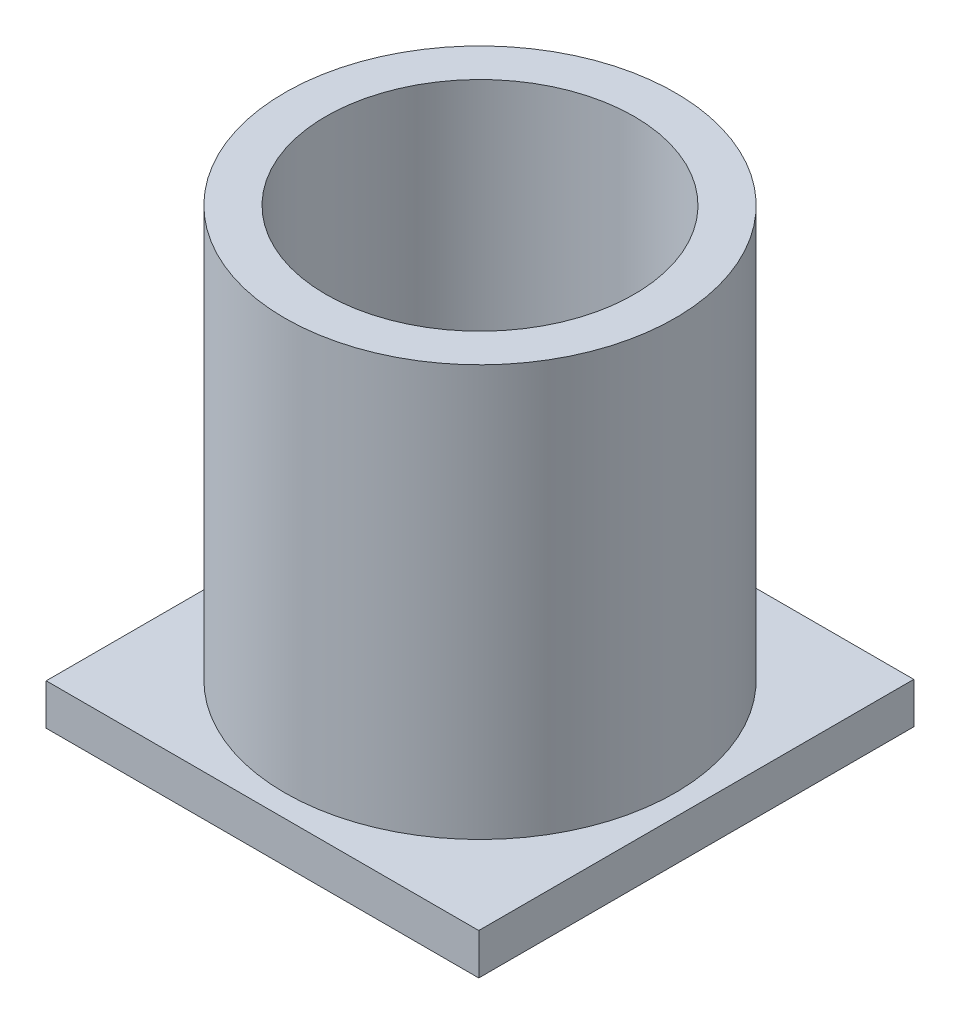
ISO-10303-21;
HEADER;
FILE_DESCRIPTION(('STEP AP214'),'2;1');
FILE_NAME('part.step','',(''),(''),'','','');
FILE_SCHEMA(('AUTOMOTIVE_DESIGN { 1 0 10303 214 1 1 1 1 }'));
ENDSEC;
DATA;
#1=APPLICATION_CONTEXT('core data for automotive mechanical design processes');
#2=APPLICATION_PROTOCOL_DEFINITION('international standard','automotive_design',2000,#1);
#3=PRODUCT_CONTEXT('',#1,'mechanical');
#4=PRODUCT('Part','Part','',(#3));
#5=PRODUCT_RELATED_PRODUCT_CATEGORY('part','',(#4));
#6=PRODUCT_DEFINITION_FORMATION('','',#4);
#7=PRODUCT_DEFINITION_CONTEXT('part definition',#1,'design');
#8=PRODUCT_DEFINITION('design','',#6,#7);
#9=PRODUCT_DEFINITION_SHAPE('','',#8);
#10=(LENGTH_UNIT() NAMED_UNIT(*) SI_UNIT(.MILLI.,.METRE.));
#11=(NAMED_UNIT(*) PLANE_ANGLE_UNIT() SI_UNIT($,.RADIAN.));
#12=(NAMED_UNIT(*) SI_UNIT($,.STERADIAN.) SOLID_ANGLE_UNIT());
#13=UNCERTAINTY_MEASURE_WITH_UNIT(LENGTH_MEASURE(1.E-05),#10,'distance_accuracy_value','');
#14=(GEOMETRIC_REPRESENTATION_CONTEXT(3) GLOBAL_UNCERTAINTY_ASSIGNED_CONTEXT((#13)) GLOBAL_UNIT_ASSIGNED_CONTEXT((#10,
#11,#12)) REPRESENTATION_CONTEXT('',''));
#15=CARTESIAN_POINT('',(0.,0.,0.));
#16=DIRECTION('',(0.,0.,1.));
#17=DIRECTION('',(1.,0.,0.));
#18=AXIS2_PLACEMENT_3D('',#15,#16,#17);
#19=CARTESIAN_POINT('',(0.000317301244510298,2318.51783606415,0.666304939163612));
#20=DIRECTION('',(0.,1.,0.));
#21=DIRECTION('',(0.,0.,1.));
#22=AXIS2_PLACEMENT_3D('',#19,#20,#21);
#23=PLANE('',#22);
#24=CARTESIAN_POINT('',(0.000317301244510298,2318.51783606415,0.666304939163612));
#25=DIRECTION('',(0.,1.,0.));
#26=DIRECTION('',(0.,0.,1.));
#27=AXIS2_PLACEMENT_3D('',#24,#25,#26);
#28=CIRCLE('',#27,1425.);
#29=CARTESIAN_POINT('',(0.000317301244510298,2318.51783606415,1425.66630493916));
#30=VERTEX_POINT('',#29);
#31=EDGE_CURVE('E11',#30,#30,#28,.T.);
#32=ORIENTED_EDGE('',*,*,#31,.T.);
#33=EDGE_LOOP('',(#32));
#34=FACE_BOUND('',#33,.T.);
#35=CARTESIAN_POINT('',(0.000317301244510298,2318.51783606415,0.666304939163612));
#36=DIRECTION('',(0.,1.,0.));
#37=DIRECTION('',(0.,0.,1.));
#38=AXIS2_PLACEMENT_3D('',#35,#36,#37);
#39=CIRCLE('',#38,1125.);
#40=CARTESIAN_POINT('',(0.000317301244510298,2318.51783606415,1125.66630493916));
#41=VERTEX_POINT('',#40);
#42=EDGE_CURVE('E45',#41,#41,#39,.T.);
#43=ORIENTED_EDGE('',*,*,#42,.F.);
#44=EDGE_LOOP('',(#43));
#45=FACE_BOUND('',#44,.T.);
#46=ADVANCED_FACE('F35',(#34,#45),#23,.T.);
#47=CARTESIAN_POINT('',(0.000317301244510298,2318.51783606415,0.666304939163612));
#48=DIRECTION('',(0.,-1.,0.));
#49=DIRECTION('',(0.,0.,-1.));
#50=AXIS2_PLACEMENT_3D('',#47,#48,#49);
#51=CYLINDRICAL_SURFACE('',#50,1425.);
#52=ORIENTED_EDGE('',*,*,#31,.F.);
#53=EDGE_LOOP('',(#52));
#54=FACE_BOUND('',#53,.T.);
#55=CARTESIAN_POINT('',(0.000317301244510298,-681.482163935852,0.666304939163612));
#56=DIRECTION('',(0.,1.,0.));
#57=DIRECTION('',(0.,0.,1.));
#58=AXIS2_PLACEMENT_3D('',#55,#56,#57);
#59=CIRCLE('',#58,1425.);
#60=CARTESIAN_POINT('',(0.000317301244510298,-681.482163935852,1425.66630493916));
#61=VERTEX_POINT('',#60);
#62=EDGE_CURVE('E115',#61,#61,#59,.T.);
#63=ORIENTED_EDGE('',*,*,#62,.T.);
#64=EDGE_LOOP('',(#63));
#65=FACE_BOUND('',#64,.T.);
#66=ADVANCED_FACE('F37',(#54,#65),#51,.T.);
#67=CARTESIAN_POINT('',(0.000317301244510298,2318.51783606415,0.666304939163612));
#68=DIRECTION('',(0.,-1.,0.));
#69=DIRECTION('',(0.,0.,-1.));
#70=AXIS2_PLACEMENT_3D('',#67,#68,#69);
#71=CYLINDRICAL_SURFACE('',#70,1125.);
#72=ORIENTED_EDGE('',*,*,#42,.T.);
#73=EDGE_LOOP('',(#72));
#74=FACE_BOUND('',#73,.T.);
#75=CARTESIAN_POINT('',(0.000317301244510298,-681.482163935852,0.666304939163612));
#76=DIRECTION('',(0.,1.,0.));
#77=DIRECTION('',(0.,0.,1.));
#78=AXIS2_PLACEMENT_3D('',#75,#76,#77);
#79=CIRCLE('',#78,1125.);
#80=CARTESIAN_POINT('',(0.000317301244510298,-681.482163935852,1125.66630493916));
#81=VERTEX_POINT('',#80);
#82=EDGE_CURVE('E118',#81,#81,#79,.T.);
#83=ORIENTED_EDGE('',*,*,#82,.F.);
#84=EDGE_LOOP('',(#83));
#85=FACE_BOUND('',#84,.T.);
#86=ADVANCED_FACE('F148',(#74,#85),#71,.F.);
#87=CARTESIAN_POINT('',(0.000317301244510298,-681.482163935852,0.666304939163612));
#88=DIRECTION('',(0.,-1.,0.));
#89=DIRECTION('',(0.,0.,-1.));
#90=AXIS2_PLACEMENT_3D('',#87,#88,#89);
#91=PLANE('',#90);
#92=CARTESIAN_POINT('',(0.000317301244510298,-681.482163935852,0.666304939163612));
#93=DIRECTION('',(0.,-1.,0.));
#94=DIRECTION('',(0.,0.,1.));
#95=AXIS2_PLACEMENT_3D('',#92,#93,#94);
#96=ELLIPSE('',#95,318.198051533946,225.);
#97=CARTESIAN_POINT('',(0.000317301244510298,-681.482163935852,318.86435647311));
#98=VERTEX_POINT('',#97);
#99=EDGE_CURVE('E108',#98,#98,#96,.T.);
#100=ORIENTED_EDGE('',*,*,#99,.T.);
#101=EDGE_LOOP('',(#100));
#102=FACE_BOUND('',#101,.T.);
#103=ORIENTED_EDGE('',*,*,#82,.T.);
#104=EDGE_LOOP('',(#103));
#105=FACE_BOUND('',#104,.T.);
#106=ADVANCED_FACE('F129',(#102,#105),#91,.F.);
#107=CARTESIAN_POINT('',(1578.24370591622,-981.482163935852,1587.95406827398));
#108=DIRECTION('',(-1.,0.,0.));
#109=DIRECTION('',(0.,0.,1.));
#110=AXIS2_PLACEMENT_3D('',#107,#108,#109);
#111=PLANE('',#110);
#112=DIRECTION('',(0.,0.,1.));
#113=VECTOR('',#112,1.);
#114=CARTESIAN_POINT('',(1578.24370591622,-681.482163935852,1587.95406827398));
#115=LINE('',#114,#113);
#116=CARTESIAN_POINT('',(1578.24370591622,-681.482163935852,-1586.62145839565));
#117=VERTEX_POINT('',#116);
#118=CARTESIAN_POINT('',(1578.24370591622,-681.482163935852,1587.95406827398));
#119=VERTEX_POINT('',#118);
#120=EDGE_CURVE('E105',#117,#119,#115,.T.);
#121=ORIENTED_EDGE('',*,*,#120,.T.);
#122=DIRECTION('',(0.,1.,0.));
#123=VECTOR('',#122,1.);
#124=CARTESIAN_POINT('',(1578.24370591622,-981.482163935852,1587.95406827398));
#125=LINE('',#124,#123);
#126=CARTESIAN_POINT('',(1578.24370591622,-981.482163935852,1587.95406827398));
#127=VERTEX_POINT('',#126);
#128=EDGE_CURVE('E96',#127,#119,#125,.T.);
#129=ORIENTED_EDGE('',*,*,#128,.F.);
#130=DIRECTION('',(0.,0.,1.));
#131=VECTOR('',#130,1.);
#132=CARTESIAN_POINT('',(1578.24370591622,-981.482163935852,1587.95406827398));
#133=LINE('',#132,#131);
#134=CARTESIAN_POINT('',(1578.24370591622,-981.482163935852,-1586.62145839565));
#135=VERTEX_POINT('',#134);
#136=EDGE_CURVE('E90',#135,#127,#133,.T.);
#137=ORIENTED_EDGE('',*,*,#136,.F.);
#138=DIRECTION('',(0.,1.,0.));
#139=VECTOR('',#138,1.);
#140=CARTESIAN_POINT('',(1578.24370591622,-981.482163935852,-1586.62145839565));
#141=LINE('',#140,#139);
#142=EDGE_CURVE('E101',#135,#117,#141,.T.);
#143=ORIENTED_EDGE('',*,*,#142,.T.);
#144=EDGE_LOOP('',(#121,#129,#137,#143));
#145=FACE_BOUND('',#144,.T.);
#146=ADVANCED_FACE('F132',(#145),#111,.F.);
#147=CARTESIAN_POINT('',(-1578.24307131373,-981.482163935852,1587.95406827398));
#148=DIRECTION('',(0.,0.,-1.));
#149=DIRECTION('',(-1.,0.,0.));
#150=AXIS2_PLACEMENT_3D('',#147,#148,#149);
#151=PLANE('',#150);
#152=DIRECTION('',(-1.,0.,0.));
#153=VECTOR('',#152,1.);
#154=CARTESIAN_POINT('',(-1578.24307131373,-681.482163935852,1587.95406827398));
#155=LINE('',#154,#153);
#156=CARTESIAN_POINT('',(-1578.24307131373,-681.482163935852,1587.95406827398));
#157=VERTEX_POINT('',#156);
#158=EDGE_CURVE('E95',#119,#157,#155,.T.);
#159=ORIENTED_EDGE('',*,*,#158,.T.);
#160=DIRECTION('',(0.,1.,0.));
#161=VECTOR('',#160,1.);
#162=CARTESIAN_POINT('',(-1578.24307131373,-981.482163935852,1587.95406827398));
#163=LINE('',#162,#161);
#164=CARTESIAN_POINT('',(-1578.24307131373,-981.482163935852,1587.95406827398));
#165=VERTEX_POINT('',#164);
#166=EDGE_CURVE('E93',#165,#157,#163,.T.);
#167=ORIENTED_EDGE('',*,*,#166,.F.);
#168=DIRECTION('',(-1.,0.,0.));
#169=VECTOR('',#168,1.);
#170=CARTESIAN_POINT('',(-1578.24307131373,-981.482163935852,1587.95406827398));
#171=LINE('',#170,#169);
#172=EDGE_CURVE('E85',#127,#165,#171,.T.);
#173=ORIENTED_EDGE('',*,*,#172,.F.);
#174=ORIENTED_EDGE('',*,*,#128,.T.);
#175=EDGE_LOOP('',(#159,#167,#173,#174));
#176=FACE_BOUND('',#175,.T.);
#177=ADVANCED_FACE('F94',(#176),#151,.F.);
#178=CARTESIAN_POINT('',(-1578.24307131373,-981.482163935852,1587.95406827398));
#179=DIRECTION('',(1.,0.,0.));
#180=DIRECTION('',(0.,0.,-1.));
#181=AXIS2_PLACEMENT_3D('',#178,#179,#180);
#182=PLANE('',#181);
#183=DIRECTION('',(0.,0.,-1.));
#184=VECTOR('',#183,1.);
#185=CARTESIAN_POINT('',(-1578.24307131373,-681.482163935852,1587.95406827398));
#186=LINE('',#185,#184);
#187=CARTESIAN_POINT('',(-1578.24307131373,-681.482163935852,-1586.62145839565));
#188=VERTEX_POINT('',#187);
#189=EDGE_CURVE('E71',#157,#188,#186,.T.);
#190=ORIENTED_EDGE('',*,*,#189,.T.);
#191=DIRECTION('',(0.,1.,0.));
#192=VECTOR('',#191,1.);
#193=CARTESIAN_POINT('',(-1578.24307131373,-981.482163935852,-1586.62145839565));
#194=LINE('',#193,#192);
#195=CARTESIAN_POINT('',(-1578.24307131373,-981.482163935852,-1586.62145839565));
#196=VERTEX_POINT('',#195);
#197=EDGE_CURVE('E97',#196,#188,#194,.T.);
#198=ORIENTED_EDGE('',*,*,#197,.F.);
#199=DIRECTION('',(0.,0.,-1.));
#200=VECTOR('',#199,1.);
#201=CARTESIAN_POINT('',(-1578.24307131373,-981.482163935852,1587.95406827398));
#202=LINE('',#201,#200);
#203=EDGE_CURVE('E88',#165,#196,#202,.T.);
#204=ORIENTED_EDGE('',*,*,#203,.F.);
#205=ORIENTED_EDGE('',*,*,#166,.T.);
#206=EDGE_LOOP('',(#190,#198,#204,#205));
#207=FACE_BOUND('',#206,.T.);
#208=ADVANCED_FACE('F99',(#207),#182,.F.);
#209=CARTESIAN_POINT('',(-1578.24307131373,-981.482163935852,-1586.62145839565));
#210=DIRECTION('',(0.,0.,1.));
#211=DIRECTION('',(1.,0.,0.));
#212=AXIS2_PLACEMENT_3D('',#209,#210,#211);
#213=PLANE('',#212);
#214=DIRECTION('',(1.,0.,0.));
#215=VECTOR('',#214,1.);
#216=CARTESIAN_POINT('',(-1578.24307131373,-681.482163935852,-1586.62145839565));
#217=LINE('',#216,#215);
#218=EDGE_CURVE('E77',#188,#117,#217,.T.);
#219=ORIENTED_EDGE('',*,*,#218,.T.);
#220=ORIENTED_EDGE('',*,*,#142,.F.);
#221=DIRECTION('',(1.,0.,0.));
#222=VECTOR('',#221,1.);
#223=CARTESIAN_POINT('',(-1578.24307131373,-981.482163935852,-1586.62145839565));
#224=LINE('',#223,#222);
#225=EDGE_CURVE('E54',#196,#135,#224,.T.);
#226=ORIENTED_EDGE('',*,*,#225,.F.);
#227=ORIENTED_EDGE('',*,*,#197,.T.);
#228=EDGE_LOOP('',(#219,#220,#226,#227));
#229=FACE_BOUND('',#228,.T.);
#230=ADVANCED_FACE('F133',(#229),#213,.F.);
#231=CARTESIAN_POINT('',(0.000317301244510298,-981.482163935852,0.666304939163612));
#232=DIRECTION('',(0.,-1.,0.));
#233=DIRECTION('',(0.,0.,-1.));
#234=AXIS2_PLACEMENT_3D('',#231,#232,#233);
#235=PLANE('',#234);
#236=CARTESIAN_POINT('',(0.000317301244510298,-981.482163935852,300.666304939164));
#237=DIRECTION('',(0.,-1.,0.));
#238=DIRECTION('',(0.,0.,1.));
#239=AXIS2_PLACEMENT_3D('',#236,#237,#238);
#240=ELLIPSE('',#239,318.198051533946,225.);
#241=CARTESIAN_POINT('',(0.000317301244510298,-981.482163935852,618.86435647311));
#242=VERTEX_POINT('',#241);
#243=EDGE_CURVE('E39',#242,#242,#240,.T.);
#244=ORIENTED_EDGE('',*,*,#243,.F.);
#245=EDGE_LOOP('',(#244));
#246=FACE_BOUND('',#245,.T.);
#247=ORIENTED_EDGE('',*,*,#136,.T.);
#248=ORIENTED_EDGE('',*,*,#172,.T.);
#249=ORIENTED_EDGE('',*,*,#203,.T.);
#250=ORIENTED_EDGE('',*,*,#225,.T.);
#251=EDGE_LOOP('',(#247,#248,#249,#250));
#252=FACE_BOUND('',#251,.T.);
#253=ADVANCED_FACE('F86',(#246,#252),#235,.T.);
#254=ORIENTED_EDGE('',*,*,#62,.F.);
#255=EDGE_LOOP('',(#254));
#256=FACE_BOUND('',#255,.T.);
#257=ORIENTED_EDGE('',*,*,#120,.F.);
#258=ORIENTED_EDGE('',*,*,#218,.F.);
#259=ORIENTED_EDGE('',*,*,#189,.F.);
#260=ORIENTED_EDGE('',*,*,#158,.F.);
#261=EDGE_LOOP('',(#257,#258,#259,#260));
#262=FACE_BOUND('',#261,.T.);
#263=ADVANCED_FACE('F124',(#256,#262),#91,.F.);
#264=CARTESIAN_POINT('',(0.000317301244510298,-301.152078045941,-379.663780950747));
#265=DIRECTION('',(0.,-0.707106781186548,0.707106781186548));
#266=DIRECTION('',(0.,-0.707106781186548,-0.707106781186548));
#267=AXIS2_PLACEMENT_3D('',#264,#265,#266);
#268=CYLINDRICAL_SURFACE('',#267,225.);
#269=ORIENTED_EDGE('',*,*,#243,.T.);
#270=EDGE_LOOP('',(#269));
#271=FACE_BOUND('',#270,.T.);
#272=ORIENTED_EDGE('',*,*,#99,.F.);
#273=EDGE_LOOP('',(#272));
#274=FACE_BOUND('',#273,.T.);
#275=ADVANCED_FACE('F127',(#271,#274),#268,.F.);
#276=CLOSED_SHELL('',(#46,#66,#86,#106,#146,#177,#208,#230,#253,#263,#275));
#277=MANIFOLD_SOLID_BREP('B2',#276);
#278=ADVANCED_BREP_SHAPE_REPRESENTATION('',(#18,#277),#14);
#279=SHAPE_DEFINITION_REPRESENTATION(#9,#278);
ENDSEC;
END-ISO-10303-21;
